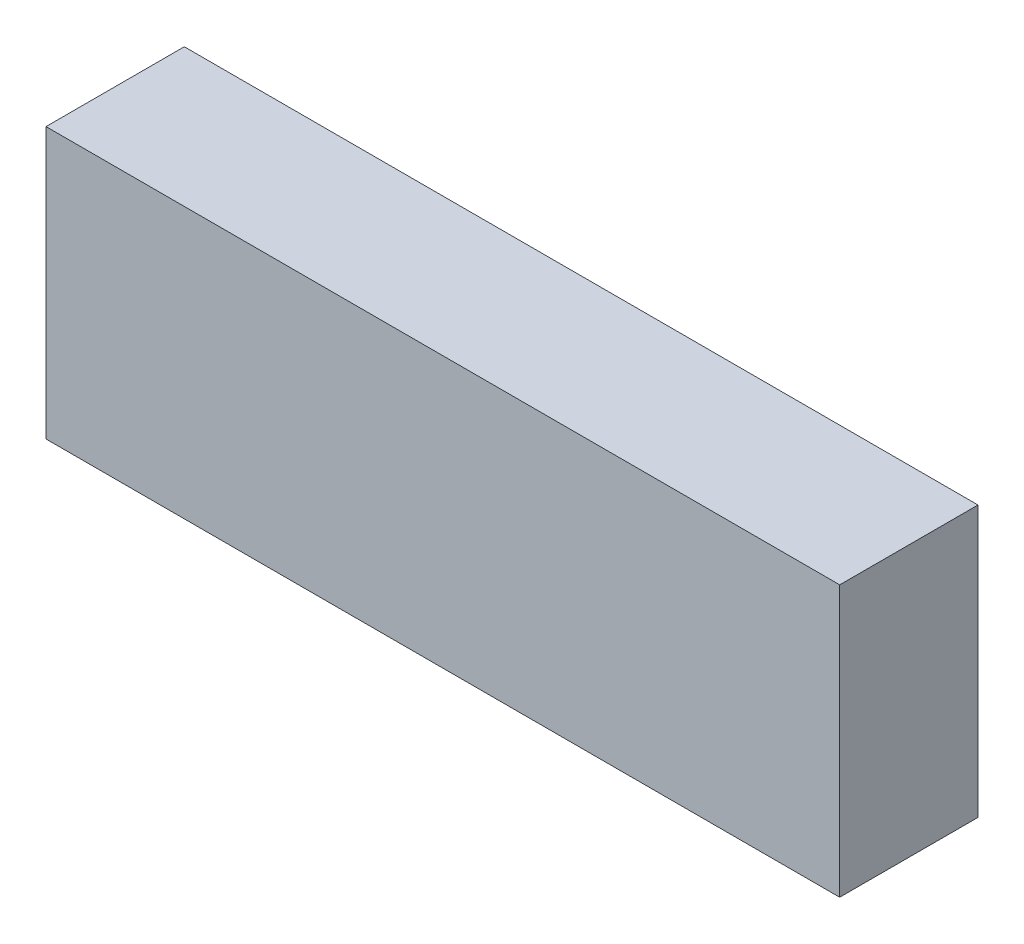
ISO-10303-21;
HEADER;
FILE_DESCRIPTION(('STEP AP214'),'2;1');
FILE_NAME('part.step','',(''),(''),'','','');
FILE_SCHEMA(('AUTOMOTIVE_DESIGN { 1 0 10303 214 1 1 1 1 }'));
ENDSEC;
DATA;
#1=APPLICATION_CONTEXT('core data for automotive mechanical design processes');
#2=APPLICATION_PROTOCOL_DEFINITION('international standard','automotive_design',2000,#1);
#3=PRODUCT_CONTEXT('',#1,'mechanical');
#4=PRODUCT('Part','Part','',(#3));
#5=PRODUCT_RELATED_PRODUCT_CATEGORY('part','',(#4));
#6=PRODUCT_DEFINITION_FORMATION('','',#4);
#7=PRODUCT_DEFINITION_CONTEXT('part definition',#1,'design');
#8=PRODUCT_DEFINITION('design','',#6,#7);
#9=PRODUCT_DEFINITION_SHAPE('','',#8);
#10=(LENGTH_UNIT() NAMED_UNIT(*) SI_UNIT(.MILLI.,.METRE.));
#11=(NAMED_UNIT(*) PLANE_ANGLE_UNIT() SI_UNIT($,.RADIAN.));
#12=(NAMED_UNIT(*) SI_UNIT($,.STERADIAN.) SOLID_ANGLE_UNIT());
#13=UNCERTAINTY_MEASURE_WITH_UNIT(LENGTH_MEASURE(1.E-05),#10,'distance_accuracy_value','');
#14=(GEOMETRIC_REPRESENTATION_CONTEXT(3) GLOBAL_UNCERTAINTY_ASSIGNED_CONTEXT((#13)) GLOBAL_UNIT_ASSIGNED_CONTEXT((#10,
#11,#12)) REPRESENTATION_CONTEXT('',''));
#15=CARTESIAN_POINT('',(0.,0.,0.));
#16=DIRECTION('',(0.,0.,1.));
#17=DIRECTION('',(1.,0.,0.));
#18=AXIS2_PLACEMENT_3D('',#15,#16,#17);
#19=CARTESIAN_POINT('',(66.,22.5,23.));
#20=DIRECTION('',(-1.,0.,0.));
#21=DIRECTION('',(0.,0.,1.));
#22=AXIS2_PLACEMENT_3D('',#19,#20,#21);
#23=PLANE('',#22);
#24=DIRECTION('',(0.,1.,0.));
#25=VECTOR('',#24,1.);
#26=CARTESIAN_POINT('',(66.,22.5,0.));
#27=LINE('',#26,#25);
#28=CARTESIAN_POINT('',(66.,-22.5,0.));
#29=VERTEX_POINT('',#28);
#30=CARTESIAN_POINT('',(66.,22.5,0.));
#31=VERTEX_POINT('',#30);
#32=EDGE_CURVE('E94',#29,#31,#27,.T.);
#33=ORIENTED_EDGE('',*,*,#32,.T.);
#34=DIRECTION('',(0.,0.,-1.));
#35=VECTOR('',#34,1.);
#36=CARTESIAN_POINT('',(66.,22.5,23.));
#37=LINE('',#36,#35);
#38=CARTESIAN_POINT('',(66.,22.5,23.));
#39=VERTEX_POINT('',#38);
#40=EDGE_CURVE('E11',#39,#31,#37,.T.);
#41=ORIENTED_EDGE('',*,*,#40,.F.);
#42=DIRECTION('',(0.,1.,0.));
#43=VECTOR('',#42,1.);
#44=CARTESIAN_POINT('',(66.,22.5,23.));
#45=LINE('',#44,#43);
#46=CARTESIAN_POINT('',(66.,-22.5,23.));
#47=VERTEX_POINT('',#46);
#48=EDGE_CURVE('E82',#47,#39,#45,.T.);
#49=ORIENTED_EDGE('',*,*,#48,.F.);
#50=DIRECTION('',(0.,0.,-1.));
#51=VECTOR('',#50,1.);
#52=CARTESIAN_POINT('',(66.,-22.5,23.));
#53=LINE('',#52,#51);
#54=EDGE_CURVE('E90',#47,#29,#53,.T.);
#55=ORIENTED_EDGE('',*,*,#54,.T.);
#56=EDGE_LOOP('',(#33,#41,#49,#55));
#57=FACE_BOUND('',#56,.T.);
#58=ADVANCED_FACE('F31',(#57),#23,.F.);
#59=CARTESIAN_POINT('',(-66.,22.5,23.));
#60=DIRECTION('',(0.,-1.,0.));
#61=DIRECTION('',(0.,0.,-1.));
#62=AXIS2_PLACEMENT_3D('',#59,#60,#61);
#63=PLANE('',#62);
#64=DIRECTION('',(-1.,0.,0.));
#65=VECTOR('',#64,1.);
#66=CARTESIAN_POINT('',(-66.,22.5,0.));
#67=LINE('',#66,#65);
#68=CARTESIAN_POINT('',(-66.,22.5,0.));
#69=VERTEX_POINT('',#68);
#70=EDGE_CURVE('E86',#31,#69,#67,.T.);
#71=ORIENTED_EDGE('',*,*,#70,.T.);
#72=DIRECTION('',(0.,0.,-1.));
#73=VECTOR('',#72,1.);
#74=CARTESIAN_POINT('',(-66.,22.5,23.));
#75=LINE('',#74,#73);
#76=CARTESIAN_POINT('',(-66.,22.5,23.));
#77=VERTEX_POINT('',#76);
#78=EDGE_CURVE('E39',#77,#69,#75,.T.);
#79=ORIENTED_EDGE('',*,*,#78,.F.);
#80=DIRECTION('',(-1.,0.,0.));
#81=VECTOR('',#80,1.);
#82=CARTESIAN_POINT('',(-66.,22.5,23.));
#83=LINE('',#82,#81);
#84=EDGE_CURVE('E77',#39,#77,#83,.T.);
#85=ORIENTED_EDGE('',*,*,#84,.F.);
#86=ORIENTED_EDGE('',*,*,#40,.T.);
#87=EDGE_LOOP('',(#71,#79,#85,#86));
#88=FACE_BOUND('',#87,.T.);
#89=ADVANCED_FACE('F85',(#88),#63,.F.);
#90=CARTESIAN_POINT('',(-66.,22.5,23.));
#91=DIRECTION('',(1.,0.,0.));
#92=DIRECTION('',(0.,0.,-1.));
#93=AXIS2_PLACEMENT_3D('',#90,#91,#92);
#94=PLANE('',#93);
#95=DIRECTION('',(0.,-1.,0.));
#96=VECTOR('',#95,1.);
#97=CARTESIAN_POINT('',(-66.,22.5,0.));
#98=LINE('',#97,#96);
#99=CARTESIAN_POINT('',(-66.,-22.5,0.));
#100=VERTEX_POINT('',#99);
#101=EDGE_CURVE('E64',#69,#100,#98,.T.);
#102=ORIENTED_EDGE('',*,*,#101,.T.);
#103=DIRECTION('',(0.,0.,-1.));
#104=VECTOR('',#103,1.);
#105=CARTESIAN_POINT('',(-66.,-22.5,23.));
#106=LINE('',#105,#104);
#107=CARTESIAN_POINT('',(-66.,-22.5,23.));
#108=VERTEX_POINT('',#107);
#109=EDGE_CURVE('E87',#108,#100,#106,.T.);
#110=ORIENTED_EDGE('',*,*,#109,.F.);
#111=DIRECTION('',(0.,-1.,0.));
#112=VECTOR('',#111,1.);
#113=CARTESIAN_POINT('',(-66.,22.5,23.));
#114=LINE('',#113,#112);
#115=EDGE_CURVE('E80',#77,#108,#114,.T.);
#116=ORIENTED_EDGE('',*,*,#115,.F.);
#117=ORIENTED_EDGE('',*,*,#78,.T.);
#118=EDGE_LOOP('',(#102,#110,#116,#117));
#119=FACE_BOUND('',#118,.T.);
#120=ADVANCED_FACE('F88',(#119),#94,.F.);
#121=CARTESIAN_POINT('',(-66.,-22.5,23.));
#122=DIRECTION('',(0.,1.,0.));
#123=DIRECTION('',(0.,0.,1.));
#124=AXIS2_PLACEMENT_3D('',#121,#122,#123);
#125=PLANE('',#124);
#126=DIRECTION('',(1.,0.,0.));
#127=VECTOR('',#126,1.);
#128=CARTESIAN_POINT('',(-66.,-22.5,0.));
#129=LINE('',#128,#127);
#130=EDGE_CURVE('E70',#100,#29,#129,.T.);
#131=ORIENTED_EDGE('',*,*,#130,.T.);
#132=ORIENTED_EDGE('',*,*,#54,.F.);
#133=DIRECTION('',(1.,0.,0.));
#134=VECTOR('',#133,1.);
#135=CARTESIAN_POINT('',(-66.,-22.5,23.));
#136=LINE('',#135,#134);
#137=EDGE_CURVE('E47',#108,#47,#136,.T.);
#138=ORIENTED_EDGE('',*,*,#137,.F.);
#139=ORIENTED_EDGE('',*,*,#109,.T.);
#140=EDGE_LOOP('',(#131,#132,#138,#139));
#141=FACE_BOUND('',#140,.T.);
#142=ADVANCED_FACE('F101',(#141),#125,.F.);
#143=CARTESIAN_POINT('',(66.,-22.5,23.));
#144=DIRECTION('',(0.,0.,1.));
#145=DIRECTION('',(1.,0.,0.));
#146=AXIS2_PLACEMENT_3D('',#143,#144,#145);
#147=PLANE('',#146);
#148=ORIENTED_EDGE('',*,*,#48,.T.);
#149=ORIENTED_EDGE('',*,*,#84,.T.);
#150=ORIENTED_EDGE('',*,*,#115,.T.);
#151=ORIENTED_EDGE('',*,*,#137,.T.);
#152=EDGE_LOOP('',(#148,#149,#150,#151));
#153=FACE_BOUND('',#152,.T.);
#154=ADVANCED_FACE('F78',(#153),#147,.T.);
#155=CARTESIAN_POINT('',(66.,-22.5,0.));
#156=DIRECTION('',(0.,0.,1.));
#157=DIRECTION('',(1.,0.,0.));
#158=AXIS2_PLACEMENT_3D('',#155,#156,#157);
#159=PLANE('',#158);
#160=ORIENTED_EDGE('',*,*,#32,.F.);
#161=ORIENTED_EDGE('',*,*,#130,.F.);
#162=ORIENTED_EDGE('',*,*,#101,.F.);
#163=ORIENTED_EDGE('',*,*,#70,.F.);
#164=EDGE_LOOP('',(#160,#161,#162,#163));
#165=FACE_BOUND('',#164,.T.);
#166=ADVANCED_FACE('F104',(#165),#159,.F.);
#167=CLOSED_SHELL('',(#58,#89,#120,#142,#154,#166));
#168=MANIFOLD_SOLID_BREP('B2',#167);
#169=ADVANCED_BREP_SHAPE_REPRESENTATION('',(#18,#168),#14);
#170=SHAPE_DEFINITION_REPRESENTATION(#9,#169);
ENDSEC;
END-ISO-10303-21;
